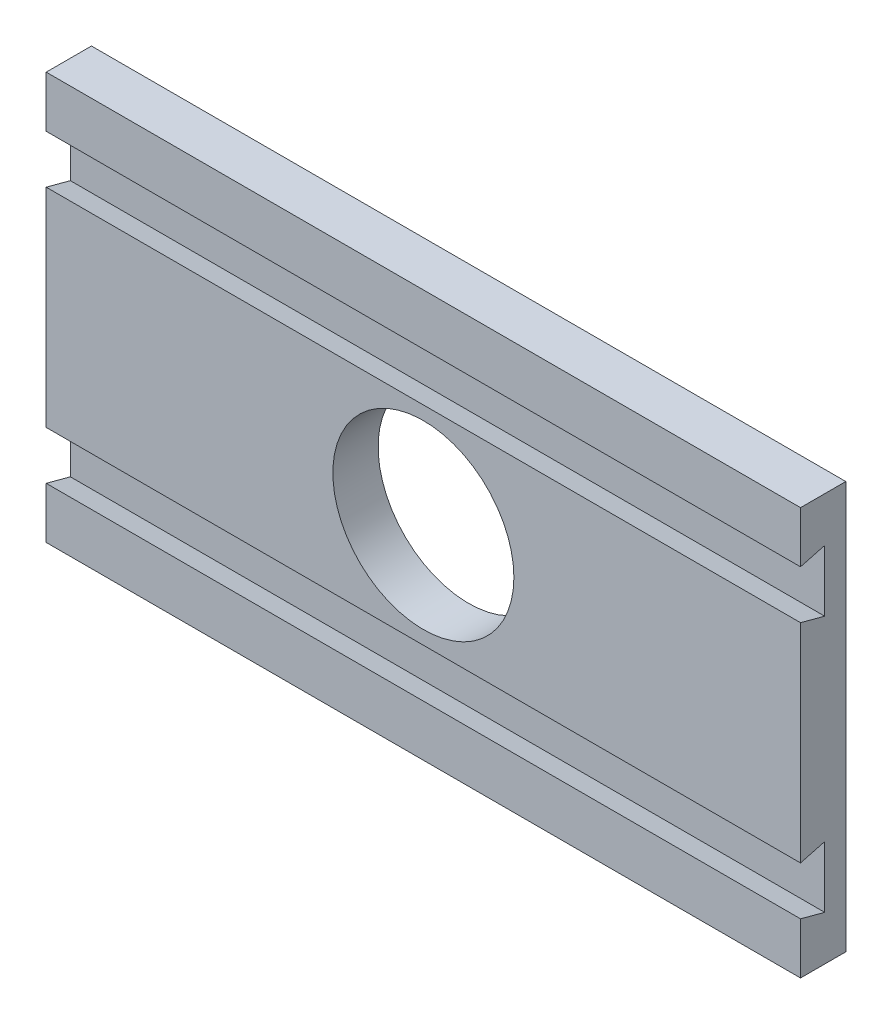
ISO-10303-21;
HEADER;
FILE_DESCRIPTION(('STEP AP214'),'2;1');
FILE_NAME('part.step','',(''),(''),'','','');
FILE_SCHEMA(('AUTOMOTIVE_DESIGN { 1 0 10303 214 1 1 1 1 }'));
ENDSEC;
DATA;
#1=APPLICATION_CONTEXT('core data for automotive mechanical design processes');
#2=APPLICATION_PROTOCOL_DEFINITION('international standard','automotive_design',2000,#1);
#3=PRODUCT_CONTEXT('',#1,'mechanical');
#4=PRODUCT('Part','Part','',(#3));
#5=PRODUCT_RELATED_PRODUCT_CATEGORY('part','',(#4));
#6=PRODUCT_DEFINITION_FORMATION('','',#4);
#7=PRODUCT_DEFINITION_CONTEXT('part definition',#1,'design');
#8=PRODUCT_DEFINITION('design','',#6,#7);
#9=PRODUCT_DEFINITION_SHAPE('','',#8);
#10=(LENGTH_UNIT() NAMED_UNIT(*) SI_UNIT(.MILLI.,.METRE.));
#11=(NAMED_UNIT(*) PLANE_ANGLE_UNIT() SI_UNIT($,.RADIAN.));
#12=(NAMED_UNIT(*) SI_UNIT($,.STERADIAN.) SOLID_ANGLE_UNIT());
#13=UNCERTAINTY_MEASURE_WITH_UNIT(LENGTH_MEASURE(1.E-05),#10,'distance_accuracy_value','');
#14=(GEOMETRIC_REPRESENTATION_CONTEXT(3) GLOBAL_UNCERTAINTY_ASSIGNED_CONTEXT((#13)) GLOBAL_UNIT_ASSIGNED_CONTEXT((#10,
#11,#12)) REPRESENTATION_CONTEXT('',''));
#15=CARTESIAN_POINT('',(0.,0.,0.));
#16=DIRECTION('',(0.,0.,1.));
#17=DIRECTION('',(1.,0.,0.));
#18=AXIS2_PLACEMENT_3D('',#15,#16,#17);
#19=CARTESIAN_POINT('',(-50.,27.,-6.));
#20=DIRECTION('',(-1.,0.,0.));
#21=DIRECTION('',(0.,0.,1.));
#22=AXIS2_PLACEMENT_3D('',#19,#20,#21);
#23=PLANE('',#22);
#24=DIRECTION('',(0.,1.,0.));
#25=VECTOR('',#24,1.);
#26=CARTESIAN_POINT('',(-50.,12.9396776707165,-3.2));
#27=LINE('',#26,#25);
#28=CARTESIAN_POINT('',(-50.,12.9396776707165,-3.2));
#29=VERTEX_POINT('',#28);
#30=CARTESIAN_POINT('',(-50.,21.0603223292835,-3.2));
#31=VERTEX_POINT('',#30);
#32=EDGE_CURVE('E143',#29,#31,#27,.T.);
#33=ORIENTED_EDGE('',*,*,#32,.T.);
#34=DIRECTION('',(0.,-0.257662650560331,0.966234939601247));
#35=VECTOR('',#34,1.);
#36=CARTESIAN_POINT('',(-50.,21.0603223292835,-3.2));
#37=LINE('',#36,#35);
#38=CARTESIAN_POINT('',(-50.,20.2069889959501,0.));
#39=VERTEX_POINT('',#38);
#40=EDGE_CURVE('E141',#31,#39,#37,.T.);
#41=ORIENTED_EDGE('',*,*,#40,.T.);
#42=DIRECTION('',(0.,-1.,0.));
#43=VECTOR('',#42,1.);
#44=CARTESIAN_POINT('',(-50.,27.,0.));
#45=LINE('',#44,#43);
#46=CARTESIAN_POINT('',(-50.,27.,0.));
#47=VERTEX_POINT('',#46);
#48=EDGE_CURVE('E193',#47,#39,#45,.T.);
#49=ORIENTED_EDGE('',*,*,#48,.F.);
#50=DIRECTION('',(0.,0.,1.));
#51=VECTOR('',#50,1.);
#52=CARTESIAN_POINT('',(-50.,27.,-6.));
#53=LINE('',#52,#51);
#54=CARTESIAN_POINT('',(-50.,27.,-6.));
#55=VERTEX_POINT('',#54);
#56=EDGE_CURVE('E207',#55,#47,#53,.T.);
#57=ORIENTED_EDGE('',*,*,#56,.F.);
#58=DIRECTION('',(0.,-1.,0.));
#59=VECTOR('',#58,1.);
#60=CARTESIAN_POINT('',(-50.,27.,-6.));
#61=LINE('',#60,#59);
#62=CARTESIAN_POINT('',(-50.,-27.,-6.));
#63=VERTEX_POINT('',#62);
#64=EDGE_CURVE('E182',#55,#63,#61,.T.);
#65=ORIENTED_EDGE('',*,*,#64,.T.);
#66=DIRECTION('',(0.,0.,1.));
#67=VECTOR('',#66,1.);
#68=CARTESIAN_POINT('',(-50.,-27.,-6.));
#69=LINE('',#68,#67);
#70=CARTESIAN_POINT('',(-50.,-27.,0.));
#71=VERTEX_POINT('',#70);
#72=EDGE_CURVE('E191',#63,#71,#69,.T.);
#73=ORIENTED_EDGE('',*,*,#72,.T.);
#74=CARTESIAN_POINT('',(-50.,-20.2069889959501,0.));
#75=VERTEX_POINT('',#74);
#76=EDGE_CURVE('E179',#75,#71,#45,.T.);
#77=ORIENTED_EDGE('',*,*,#76,.F.);
#78=DIRECTION('',(0.,-0.257662650560331,-0.966234939601247));
#79=VECTOR('',#78,1.);
#80=CARTESIAN_POINT('',(-50.,-21.0603223292835,-3.2));
#81=LINE('',#80,#79);
#82=CARTESIAN_POINT('',(-50.,-21.0603223292835,-3.2));
#83=VERTEX_POINT('',#82);
#84=EDGE_CURVE('E52',#75,#83,#81,.T.);
#85=ORIENTED_EDGE('',*,*,#84,.T.);
#86=DIRECTION('',(0.,1.,0.));
#87=VECTOR('',#86,1.);
#88=CARTESIAN_POINT('',(-50.,-12.9396776707165,-3.2));
#89=LINE('',#88,#87);
#90=CARTESIAN_POINT('',(-50.,-12.9396776707165,-3.2));
#91=VERTEX_POINT('',#90);
#92=EDGE_CURVE('E164',#83,#91,#89,.T.);
#93=ORIENTED_EDGE('',*,*,#92,.T.);
#94=DIRECTION('',(0.,-0.257662650560333,0.966234939601246));
#95=VECTOR('',#94,1.);
#96=CARTESIAN_POINT('',(-50.,-13.8463443373832,0.2));
#97=LINE('',#96,#95);
#98=CARTESIAN_POINT('',(-50.,-13.7930110040499,0.));
#99=VERTEX_POINT('',#98);
#100=EDGE_CURVE('E159',#91,#99,#97,.T.);
#101=ORIENTED_EDGE('',*,*,#100,.T.);
#102=CARTESIAN_POINT('',(-50.,13.7930110040499,0.));
#103=VERTEX_POINT('',#102);
#104=EDGE_CURVE('E200',#103,#99,#45,.T.);
#105=ORIENTED_EDGE('',*,*,#104,.F.);
#106=DIRECTION('',(0.,-0.257662650560333,-0.966234939601246));
#107=VECTOR('',#106,1.);
#108=CARTESIAN_POINT('',(-50.,13.8463443373832,0.2));
#109=LINE('',#108,#107);
#110=EDGE_CURVE('E64',#103,#29,#109,.T.);
#111=ORIENTED_EDGE('',*,*,#110,.T.);
#112=EDGE_LOOP('',(#33,#41,#49,#57,#65,#73,#77,#85,#93,#101,#105,#111));
#113=FACE_BOUND('',#112,.T.);
#114=ADVANCED_FACE('F39',(#113),#23,.T.);
#115=CARTESIAN_POINT('',(0.,0.,0.));
#116=DIRECTION('',(0.,0.,1.));
#117=DIRECTION('',(1.,0.,0.));
#118=AXIS2_PLACEMENT_3D('',#115,#116,#117);
#119=PLANE('',#118);
#120=DIRECTION('',(-1.,0.,0.));
#121=VECTOR('',#120,1.);
#122=CARTESIAN_POINT('',(0.,20.2069889959501,0.));
#123=LINE('',#122,#121);
#124=CARTESIAN_POINT('',(50.,20.2069889959501,0.));
#125=VERTEX_POINT('',#124);
#126=EDGE_CURVE('E11',#125,#39,#123,.T.);
#127=ORIENTED_EDGE('',*,*,#126,.F.);
#128=DIRECTION('',(0.,1.,0.));
#129=VECTOR('',#128,1.);
#130=CARTESIAN_POINT('',(50.,-27.,0.));
#131=LINE('',#130,#129);
#132=CARTESIAN_POINT('',(50.,27.,0.));
#133=VERTEX_POINT('',#132);
#134=EDGE_CURVE('E205',#125,#133,#131,.T.);
#135=ORIENTED_EDGE('',*,*,#134,.T.);
#136=DIRECTION('',(-1.,0.,0.));
#137=VECTOR('',#136,1.);
#138=CARTESIAN_POINT('',(50.,27.,0.));
#139=LINE('',#138,#137);
#140=EDGE_CURVE('E183',#133,#47,#139,.T.);
#141=ORIENTED_EDGE('',*,*,#140,.T.);
#142=ORIENTED_EDGE('',*,*,#48,.T.);
#143=EDGE_LOOP('',(#127,#135,#141,#142));
#144=FACE_BOUND('',#143,.T.);
#145=ADVANCED_FACE('F248',(#144),#119,.T.);
#146=DIRECTION('',(1.,0.,0.));
#147=VECTOR('',#146,1.);
#148=CARTESIAN_POINT('',(0.,13.7930110040499,0.));
#149=LINE('',#148,#147);
#150=CARTESIAN_POINT('',(50.,13.7930110040499,0.));
#151=VERTEX_POINT('',#150);
#152=EDGE_CURVE('E46',#103,#151,#149,.T.);
#153=ORIENTED_EDGE('',*,*,#152,.F.);
#154=ORIENTED_EDGE('',*,*,#104,.T.);
#155=DIRECTION('',(-1.,0.,0.));
#156=VECTOR('',#155,1.);
#157=CARTESIAN_POINT('',(0.,-13.7930110040499,0.));
#158=LINE('',#157,#156);
#159=CARTESIAN_POINT('',(50.,-13.7930110040499,0.));
#160=VERTEX_POINT('',#159);
#161=EDGE_CURVE('E219',#160,#99,#158,.T.);
#162=ORIENTED_EDGE('',*,*,#161,.F.);
#163=EDGE_CURVE('E206',#160,#151,#131,.T.);
#164=ORIENTED_EDGE('',*,*,#163,.T.);
#165=EDGE_LOOP('',(#153,#154,#162,#164));
#166=FACE_BOUND('',#165,.T.);
#167=CARTESIAN_POINT('',(0.,0.,0.));
#168=DIRECTION('',(0.,0.,1.));
#169=DIRECTION('',(1.,0.,0.));
#170=AXIS2_PLACEMENT_3D('',#167,#168,#169);
#171=CIRCLE('',#170,12.);
#172=CARTESIAN_POINT('',(12.,0.,0.));
#173=VERTEX_POINT('',#172);
#174=EDGE_CURVE('E154',#173,#173,#171,.T.);
#175=ORIENTED_EDGE('',*,*,#174,.F.);
#176=EDGE_LOOP('',(#175));
#177=FACE_BOUND('',#176,.T.);
#178=ADVANCED_FACE('F232',(#166,#177),#119,.T.);
#179=CARTESIAN_POINT('',(50.,27.,-6.));
#180=DIRECTION('',(0.,1.,0.));
#181=DIRECTION('',(0.,0.,1.));
#182=AXIS2_PLACEMENT_3D('',#179,#180,#181);
#183=PLANE('',#182);
#184=ORIENTED_EDGE('',*,*,#140,.F.);
#185=DIRECTION('',(0.,0.,1.));
#186=VECTOR('',#185,1.);
#187=CARTESIAN_POINT('',(50.,27.,-6.));
#188=LINE('',#187,#186);
#189=CARTESIAN_POINT('',(50.,27.,-6.));
#190=VERTEX_POINT('',#189);
#191=EDGE_CURVE('E215',#190,#133,#188,.T.);
#192=ORIENTED_EDGE('',*,*,#191,.F.);
#193=DIRECTION('',(-1.,0.,0.));
#194=VECTOR('',#193,1.);
#195=CARTESIAN_POINT('',(50.,27.,-6.));
#196=LINE('',#195,#194);
#197=EDGE_CURVE('E192',#190,#55,#196,.T.);
#198=ORIENTED_EDGE('',*,*,#197,.T.);
#199=ORIENTED_EDGE('',*,*,#56,.T.);
#200=EDGE_LOOP('',(#184,#192,#198,#199));
#201=FACE_BOUND('',#200,.T.);
#202=ADVANCED_FACE('F255',(#201),#183,.T.);
#203=CARTESIAN_POINT('',(50.,-27.,-6.));
#204=DIRECTION('',(1.,0.,0.));
#205=DIRECTION('',(0.,0.,-1.));
#206=AXIS2_PLACEMENT_3D('',#203,#204,#205);
#207=PLANE('',#206);
#208=DIRECTION('',(0.,-0.257662650560333,-0.966234939601246));
#209=VECTOR('',#208,1.);
#210=CARTESIAN_POINT('',(50.,13.8463443373832,0.2));
#211=LINE('',#210,#209);
#212=CARTESIAN_POINT('',(50.,12.9396776707165,-3.2));
#213=VERTEX_POINT('',#212);
#214=EDGE_CURVE('E121',#151,#213,#211,.T.);
#215=ORIENTED_EDGE('',*,*,#214,.F.);
#216=ORIENTED_EDGE('',*,*,#163,.F.);
#217=DIRECTION('',(0.,-0.257662650560333,0.966234939601246));
#218=VECTOR('',#217,1.);
#219=CARTESIAN_POINT('',(50.,-13.8463443373832,0.2));
#220=LINE('',#219,#218);
#221=CARTESIAN_POINT('',(50.,-12.9396776707165,-3.2));
#222=VERTEX_POINT('',#221);
#223=EDGE_CURVE('E166',#222,#160,#220,.T.);
#224=ORIENTED_EDGE('',*,*,#223,.F.);
#225=DIRECTION('',(0.,1.,0.));
#226=VECTOR('',#225,1.);
#227=CARTESIAN_POINT('',(50.,-12.9396776707165,-3.2));
#228=LINE('',#227,#226);
#229=CARTESIAN_POINT('',(50.,-21.0603223292835,-3.2));
#230=VERTEX_POINT('',#229);
#231=EDGE_CURVE('E174',#230,#222,#228,.T.);
#232=ORIENTED_EDGE('',*,*,#231,.F.);
#233=DIRECTION('',(0.,-0.257662650560331,-0.966234939601247));
#234=VECTOR('',#233,1.);
#235=CARTESIAN_POINT('',(50.,-21.0603223292835,-3.2));
#236=LINE('',#235,#234);
#237=CARTESIAN_POINT('',(50.,-20.2069889959501,0.));
#238=VERTEX_POINT('',#237);
#239=EDGE_CURVE('E133',#238,#230,#236,.T.);
#240=ORIENTED_EDGE('',*,*,#239,.F.);
#241=CARTESIAN_POINT('',(50.,-27.,0.));
#242=VERTEX_POINT('',#241);
#243=EDGE_CURVE('E201',#242,#238,#131,.T.);
#244=ORIENTED_EDGE('',*,*,#243,.F.);
#245=DIRECTION('',(0.,0.,1.));
#246=VECTOR('',#245,1.);
#247=CARTESIAN_POINT('',(50.,-27.,-6.));
#248=LINE('',#247,#246);
#249=CARTESIAN_POINT('',(50.,-27.,-6.));
#250=VERTEX_POINT('',#249);
#251=EDGE_CURVE('E214',#250,#242,#248,.T.);
#252=ORIENTED_EDGE('',*,*,#251,.F.);
#253=DIRECTION('',(0.,1.,0.));
#254=VECTOR('',#253,1.);
#255=CARTESIAN_POINT('',(50.,-27.,-6.));
#256=LINE('',#255,#254);
#257=EDGE_CURVE('E190',#250,#190,#256,.T.);
#258=ORIENTED_EDGE('',*,*,#257,.T.);
#259=ORIENTED_EDGE('',*,*,#191,.T.);
#260=ORIENTED_EDGE('',*,*,#134,.F.);
#261=DIRECTION('',(0.,-0.257662650560331,0.966234939601247));
#262=VECTOR('',#261,1.);
#263=CARTESIAN_POINT('',(50.,21.0603223292835,-3.2));
#264=LINE('',#263,#262);
#265=CARTESIAN_POINT('',(50.,21.0603223292835,-3.2));
#266=VERTEX_POINT('',#265);
#267=EDGE_CURVE('E150',#266,#125,#264,.T.);
#268=ORIENTED_EDGE('',*,*,#267,.F.);
#269=DIRECTION('',(0.,1.,0.));
#270=VECTOR('',#269,1.);
#271=CARTESIAN_POINT('',(50.,12.9396776707165,-3.2));
#272=LINE('',#271,#270);
#273=EDGE_CURVE('E135',#213,#266,#272,.T.);
#274=ORIENTED_EDGE('',*,*,#273,.F.);
#275=EDGE_LOOP('',(#215,#216,#224,#232,#240,#244,#252,#258,#259,#260,#268,#274));
#276=FACE_BOUND('',#275,.T.);
#277=ADVANCED_FACE('F144',(#276),#207,.T.);
#278=CARTESIAN_POINT('',(-50.,-27.,-6.));
#279=DIRECTION('',(0.,-1.,0.));
#280=DIRECTION('',(0.,0.,-1.));
#281=AXIS2_PLACEMENT_3D('',#278,#279,#280);
#282=PLANE('',#281);
#283=DIRECTION('',(1.,0.,0.));
#284=VECTOR('',#283,1.);
#285=CARTESIAN_POINT('',(-50.,-27.,0.));
#286=LINE('',#285,#284);
#287=EDGE_CURVE('E196',#71,#242,#286,.T.);
#288=ORIENTED_EDGE('',*,*,#287,.F.);
#289=ORIENTED_EDGE('',*,*,#72,.F.);
#290=DIRECTION('',(1.,0.,0.));
#291=VECTOR('',#290,1.);
#292=CARTESIAN_POINT('',(-50.,-27.,-6.));
#293=LINE('',#292,#291);
#294=EDGE_CURVE('E184',#63,#250,#293,.T.);
#295=ORIENTED_EDGE('',*,*,#294,.T.);
#296=ORIENTED_EDGE('',*,*,#251,.T.);
#297=EDGE_LOOP('',(#288,#289,#295,#296));
#298=FACE_BOUND('',#297,.T.);
#299=ADVANCED_FACE('F238',(#298),#282,.T.);
#300=CARTESIAN_POINT('',(0.,0.,-6.));
#301=DIRECTION('',(0.,0.,1.));
#302=DIRECTION('',(1.,0.,0.));
#303=AXIS2_PLACEMENT_3D('',#300,#301,#302);
#304=PLANE('',#303);
#305=CARTESIAN_POINT('',(0.,0.,-6.));
#306=DIRECTION('',(0.,0.,1.));
#307=DIRECTION('',(1.,0.,0.));
#308=AXIS2_PLACEMENT_3D('',#305,#306,#307);
#309=CIRCLE('',#308,12.);
#310=CARTESIAN_POINT('',(12.,0.,-6.));
#311=VERTEX_POINT('',#310);
#312=EDGE_CURVE('E172',#311,#311,#309,.T.);
#313=ORIENTED_EDGE('',*,*,#312,.T.);
#314=EDGE_LOOP('',(#313));
#315=FACE_BOUND('',#314,.T.);
#316=ORIENTED_EDGE('',*,*,#64,.F.);
#317=ORIENTED_EDGE('',*,*,#197,.F.);
#318=ORIENTED_EDGE('',*,*,#257,.F.);
#319=ORIENTED_EDGE('',*,*,#294,.F.);
#320=EDGE_LOOP('',(#316,#317,#318,#319));
#321=FACE_BOUND('',#320,.T.);
#322=ADVANCED_FACE('F278',(#315,#321),#304,.F.);
#323=DIRECTION('',(1.,0.,0.));
#324=VECTOR('',#323,1.);
#325=CARTESIAN_POINT('',(0.,-20.2069889959501,0.));
#326=LINE('',#325,#324);
#327=EDGE_CURVE('E211',#75,#238,#326,.T.);
#328=ORIENTED_EDGE('',*,*,#327,.F.);
#329=ORIENTED_EDGE('',*,*,#76,.T.);
#330=ORIENTED_EDGE('',*,*,#287,.T.);
#331=ORIENTED_EDGE('',*,*,#243,.T.);
#332=EDGE_LOOP('',(#328,#329,#330,#331));
#333=FACE_BOUND('',#332,.T.);
#334=ADVANCED_FACE('F233',(#333),#119,.T.);
#335=CARTESIAN_POINT('',(0.,0.,-6.));
#336=DIRECTION('',(0.,0.,1.));
#337=DIRECTION('',(1.,0.,0.));
#338=AXIS2_PLACEMENT_3D('',#335,#336,#337);
#339=CYLINDRICAL_SURFACE('',#338,12.);
#340=ORIENTED_EDGE('',*,*,#312,.F.);
#341=EDGE_LOOP('',(#340));
#342=FACE_BOUND('',#341,.T.);
#343=ORIENTED_EDGE('',*,*,#174,.T.);
#344=EDGE_LOOP('',(#343));
#345=FACE_BOUND('',#344,.T.);
#346=ADVANCED_FACE('F276',(#342,#345),#339,.F.);
#347=CARTESIAN_POINT('',(-50.,-13.8463443373832,0.2));
#348=DIRECTION('',(0.,0.966234939601246,0.257662650560333));
#349=DIRECTION('',(0.,-0.257662650560333,0.966234939601246));
#350=AXIS2_PLACEMENT_3D('',#347,#348,#349);
#351=PLANE('',#350);
#352=ORIENTED_EDGE('',*,*,#161,.T.);
#353=ORIENTED_EDGE('',*,*,#100,.F.);
#354=DIRECTION('',(1.,0.,0.));
#355=VECTOR('',#354,1.);
#356=CARTESIAN_POINT('',(-50.,-12.9396776707165,-3.2));
#357=LINE('',#356,#355);
#358=EDGE_CURVE('E161',#91,#222,#357,.T.);
#359=ORIENTED_EDGE('',*,*,#358,.T.);
#360=ORIENTED_EDGE('',*,*,#223,.T.);
#361=EDGE_LOOP('',(#352,#353,#359,#360));
#362=FACE_BOUND('',#361,.T.);
#363=ADVANCED_FACE('F221',(#362),#351,.F.);
#364=CARTESIAN_POINT('',(-50.,-12.9396776707165,-3.2));
#365=DIRECTION('',(0.,0.,-1.));
#366=DIRECTION('',(-1.,0.,0.));
#367=AXIS2_PLACEMENT_3D('',#364,#365,#366);
#368=PLANE('',#367);
#369=ORIENTED_EDGE('',*,*,#358,.F.);
#370=ORIENTED_EDGE('',*,*,#92,.F.);
#371=DIRECTION('',(1.,0.,0.));
#372=VECTOR('',#371,1.);
#373=CARTESIAN_POINT('',(-50.,-21.0603223292835,-3.2));
#374=LINE('',#373,#372);
#375=EDGE_CURVE('E160',#83,#230,#374,.T.);
#376=ORIENTED_EDGE('',*,*,#375,.T.);
#377=ORIENTED_EDGE('',*,*,#231,.T.);
#378=EDGE_LOOP('',(#369,#370,#376,#377));
#379=FACE_BOUND('',#378,.T.);
#380=ADVANCED_FACE('F250',(#379),#368,.F.);
#381=CARTESIAN_POINT('',(-50.,-21.0603223292835,-3.2));
#382=DIRECTION('',(0.,-0.966234939601247,0.257662650560331));
#383=DIRECTION('',(0.,-0.257662650560331,-0.966234939601247));
#384=AXIS2_PLACEMENT_3D('',#381,#382,#383);
#385=PLANE('',#384);
#386=ORIENTED_EDGE('',*,*,#327,.T.);
#387=ORIENTED_EDGE('',*,*,#239,.T.);
#388=ORIENTED_EDGE('',*,*,#375,.F.);
#389=ORIENTED_EDGE('',*,*,#84,.F.);
#390=EDGE_LOOP('',(#386,#387,#388,#389));
#391=FACE_BOUND('',#390,.T.);
#392=ADVANCED_FACE('F242',(#391),#385,.F.);
#393=CARTESIAN_POINT('',(-50.,21.0603223292835,-3.2));
#394=DIRECTION('',(0.,0.966234939601247,0.257662650560331));
#395=DIRECTION('',(0.,-0.257662650560331,0.966234939601247));
#396=AXIS2_PLACEMENT_3D('',#393,#394,#395);
#397=PLANE('',#396);
#398=ORIENTED_EDGE('',*,*,#126,.T.);
#399=ORIENTED_EDGE('',*,*,#40,.F.);
#400=DIRECTION('',(1.,0.,0.));
#401=VECTOR('',#400,1.);
#402=CARTESIAN_POINT('',(-50.,21.0603223292835,-3.2));
#403=LINE('',#402,#401);
#404=EDGE_CURVE('E142',#31,#266,#403,.T.);
#405=ORIENTED_EDGE('',*,*,#404,.T.);
#406=ORIENTED_EDGE('',*,*,#267,.T.);
#407=EDGE_LOOP('',(#398,#399,#405,#406));
#408=FACE_BOUND('',#407,.T.);
#409=ADVANCED_FACE('F256',(#408),#397,.F.);
#410=CARTESIAN_POINT('',(-50.,12.9396776707165,-3.2));
#411=DIRECTION('',(0.,0.,-1.));
#412=DIRECTION('',(-1.,0.,0.));
#413=AXIS2_PLACEMENT_3D('',#410,#411,#412);
#414=PLANE('',#413);
#415=ORIENTED_EDGE('',*,*,#404,.F.);
#416=ORIENTED_EDGE('',*,*,#32,.F.);
#417=DIRECTION('',(1.,0.,0.));
#418=VECTOR('',#417,1.);
#419=CARTESIAN_POINT('',(-50.,12.9396776707165,-3.2));
#420=LINE('',#419,#418);
#421=EDGE_CURVE('E130',#29,#213,#420,.T.);
#422=ORIENTED_EDGE('',*,*,#421,.T.);
#423=ORIENTED_EDGE('',*,*,#273,.T.);
#424=EDGE_LOOP('',(#415,#416,#422,#423));
#425=FACE_BOUND('',#424,.T.);
#426=ADVANCED_FACE('F139',(#425),#414,.F.);
#427=CARTESIAN_POINT('',(-50.,13.8463443373832,0.2));
#428=DIRECTION('',(0.,-0.966234939601246,0.257662650560333));
#429=DIRECTION('',(0.,-0.257662650560333,-0.966234939601246));
#430=AXIS2_PLACEMENT_3D('',#427,#428,#429);
#431=PLANE('',#430);
#432=ORIENTED_EDGE('',*,*,#152,.T.);
#433=ORIENTED_EDGE('',*,*,#214,.T.);
#434=ORIENTED_EDGE('',*,*,#421,.F.);
#435=ORIENTED_EDGE('',*,*,#110,.F.);
#436=EDGE_LOOP('',(#432,#433,#434,#435));
#437=FACE_BOUND('',#436,.T.);
#438=ADVANCED_FACE('F127',(#437),#431,.F.);
#439=CLOSED_SHELL('',(#114,#145,#178,#202,#277,#299,#322,#334,#346,#363,#380,#392,#409,#426,#438));
#440=MANIFOLD_SOLID_BREP('B2',#439);
#441=ADVANCED_BREP_SHAPE_REPRESENTATION('',(#18,#440),#14);
#442=SHAPE_DEFINITION_REPRESENTATION(#9,#441);
ENDSEC;
END-ISO-10303-21;
